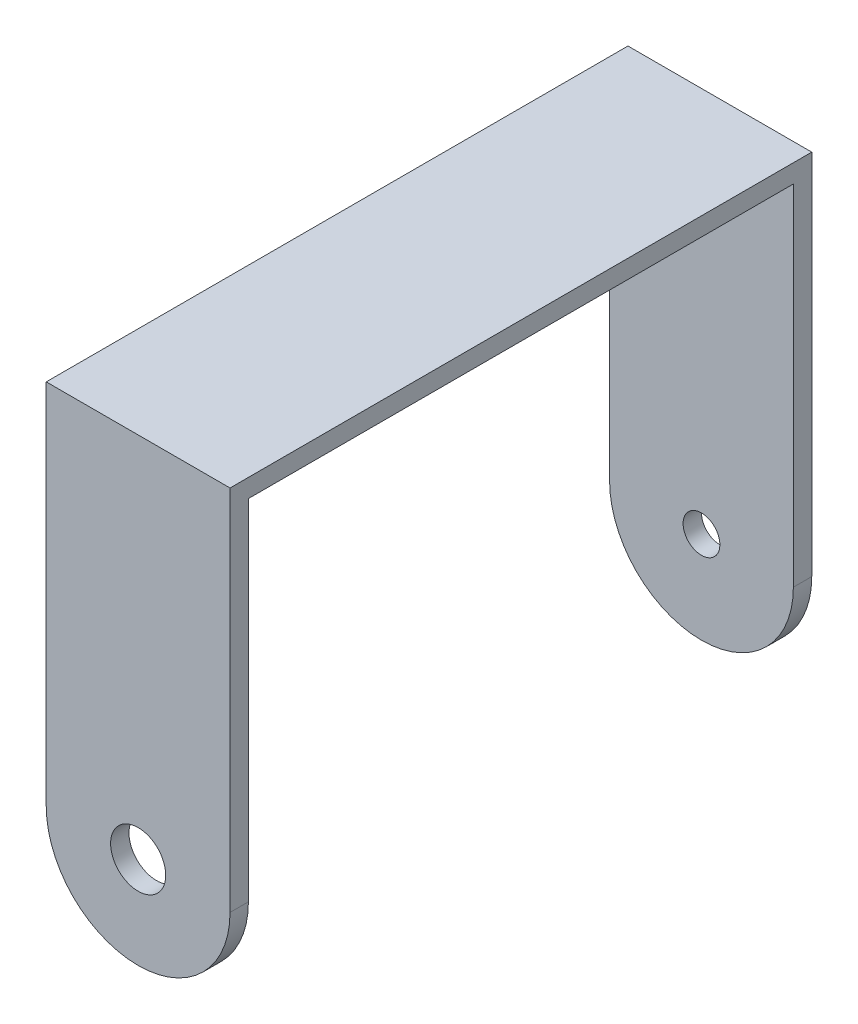
ISO-10303-21;
HEADER;
FILE_DESCRIPTION(('STEP AP214'),'2;1');
FILE_NAME('part.step','',(''),(''),'','','');
FILE_SCHEMA(('AUTOMOTIVE_DESIGN { 1 0 10303 214 1 1 1 1 }'));
ENDSEC;
DATA;
#1=APPLICATION_CONTEXT('core data for automotive mechanical design processes');
#2=APPLICATION_PROTOCOL_DEFINITION('international standard','automotive_design',2000,#1);
#3=PRODUCT_CONTEXT('',#1,'mechanical');
#4=PRODUCT('Part','Part','',(#3));
#5=PRODUCT_RELATED_PRODUCT_CATEGORY('part','',(#4));
#6=PRODUCT_DEFINITION_FORMATION('','',#4);
#7=PRODUCT_DEFINITION_CONTEXT('part definition',#1,'design');
#8=PRODUCT_DEFINITION('design','',#6,#7);
#9=PRODUCT_DEFINITION_SHAPE('','',#8);
#10=(LENGTH_UNIT() NAMED_UNIT(*) SI_UNIT(.MILLI.,.METRE.));
#11=(NAMED_UNIT(*) PLANE_ANGLE_UNIT() SI_UNIT($,.RADIAN.));
#12=(NAMED_UNIT(*) SI_UNIT($,.STERADIAN.) SOLID_ANGLE_UNIT());
#13=UNCERTAINTY_MEASURE_WITH_UNIT(LENGTH_MEASURE(1.E-05),#10,'distance_accuracy_value','');
#14=(GEOMETRIC_REPRESENTATION_CONTEXT(3) GLOBAL_UNCERTAINTY_ASSIGNED_CONTEXT((#13)) GLOBAL_UNIT_ASSIGNED_CONTEXT((#10,
#11,#12)) REPRESENTATION_CONTEXT('',''));
#15=CARTESIAN_POINT('',(0.,0.,0.));
#16=DIRECTION('',(0.,0.,1.));
#17=DIRECTION('',(1.,0.,0.));
#18=AXIS2_PLACEMENT_3D('',#15,#16,#17);
#19=CARTESIAN_POINT('',(0.,38.,63.3));
#20=DIRECTION('',(0.,1.,0.));
#21=DIRECTION('',(0.,0.,1.));
#22=AXIS2_PLACEMENT_3D('',#19,#20,#21);
#23=PLANE('',#22);
#24=DIRECTION('',(1.,0.,0.));
#25=VECTOR('',#24,1.);
#26=CARTESIAN_POINT('',(0.,38.,61.3));
#27=LINE('',#26,#25);
#28=CARTESIAN_POINT('',(0.,38.,61.3));
#29=VERTEX_POINT('',#28);
#30=CARTESIAN_POINT('',(20.,38.,61.3));
#31=VERTEX_POINT('',#30);
#32=EDGE_CURVE('E11',#29,#31,#27,.T.);
#33=ORIENTED_EDGE('',*,*,#32,.F.);
#34=DIRECTION('',(0.,0.,-1.));
#35=VECTOR('',#34,1.);
#36=CARTESIAN_POINT('',(0.,38.,63.3));
#37=LINE('',#36,#35);
#38=CARTESIAN_POINT('',(0.,38.,2.));
#39=VERTEX_POINT('',#38);
#40=EDGE_CURVE('E49',#29,#39,#37,.T.);
#41=ORIENTED_EDGE('',*,*,#40,.T.);
#42=DIRECTION('',(1.,0.,0.));
#43=VECTOR('',#42,1.);
#44=CARTESIAN_POINT('',(0.,38.,2.));
#45=LINE('',#44,#43);
#46=CARTESIAN_POINT('',(20.,38.,2.));
#47=VERTEX_POINT('',#46);
#48=EDGE_CURVE('E125',#39,#47,#45,.T.);
#49=ORIENTED_EDGE('',*,*,#48,.T.);
#50=DIRECTION('',(0.,0.,-1.));
#51=VECTOR('',#50,1.);
#52=CARTESIAN_POINT('',(20.,38.,63.3));
#53=LINE('',#52,#51);
#54=EDGE_CURVE('E102',#31,#47,#53,.T.);
#55=ORIENTED_EDGE('',*,*,#54,.F.);
#56=EDGE_LOOP('',(#33,#41,#49,#55));
#57=FACE_BOUND('',#56,.T.);
#58=ADVANCED_FACE('F34',(#57),#23,.F.);
#59=CARTESIAN_POINT('',(10.,0.,2.));
#60=DIRECTION('',(0.,0.,-1.));
#61=DIRECTION('',(-1.,0.,0.));
#62=AXIS2_PLACEMENT_3D('',#59,#60,#61);
#63=PLANE('',#62);
#64=CARTESIAN_POINT('',(10.,0.,2.));
#65=DIRECTION('',(0.,0.,1.));
#66=DIRECTION('',(1.,0.,0.));
#67=AXIS2_PLACEMENT_3D('',#64,#65,#66);
#68=CIRCLE('',#67,2.);
#69=CARTESIAN_POINT('',(12.,0.,2.));
#70=VERTEX_POINT('',#69);
#71=EDGE_CURVE('E159',#70,#70,#68,.T.);
#72=ORIENTED_EDGE('',*,*,#71,.F.);
#73=EDGE_LOOP('',(#72));
#74=FACE_BOUND('',#73,.T.);
#75=ORIENTED_EDGE('',*,*,#48,.F.);
#76=DIRECTION('',(0.,-1.,0.));
#77=VECTOR('',#76,1.);
#78=CARTESIAN_POINT('',(0.,0.,2.));
#79=LINE('',#78,#77);
#80=CARTESIAN_POINT('',(0.,0.,2.));
#81=VERTEX_POINT('',#80);
#82=EDGE_CURVE('E57',#39,#81,#79,.T.);
#83=ORIENTED_EDGE('',*,*,#82,.T.);
#84=CARTESIAN_POINT('',(10.,0.,2.));
#85=DIRECTION('',(0.,0.,1.));
#86=DIRECTION('',(-1.,0.,0.));
#87=AXIS2_PLACEMENT_3D('',#84,#85,#86);
#88=CIRCLE('',#87,10.);
#89=CARTESIAN_POINT('',(20.,0.,2.));
#90=VERTEX_POINT('',#89);
#91=EDGE_CURVE('E88',#81,#90,#88,.T.);
#92=ORIENTED_EDGE('',*,*,#91,.T.);
#93=DIRECTION('',(0.,1.,0.));
#94=VECTOR('',#93,1.);
#95=CARTESIAN_POINT('',(20.,0.,2.));
#96=LINE('',#95,#94);
#97=EDGE_CURVE('E116',#90,#47,#96,.T.);
#98=ORIENTED_EDGE('',*,*,#97,.T.);
#99=EDGE_LOOP('',(#75,#83,#92,#98));
#100=FACE_BOUND('',#99,.T.);
#101=ADVANCED_FACE('F120',(#74,#100),#63,.F.);
#102=CARTESIAN_POINT('',(10.,0.,2.));
#103=DIRECTION('',(0.,0.,-1.));
#104=DIRECTION('',(-1.,0.,0.));
#105=AXIS2_PLACEMENT_3D('',#102,#103,#104);
#106=CYLINDRICAL_SURFACE('',#105,10.);
#107=CARTESIAN_POINT('',(10.,0.,0.));
#108=DIRECTION('',(0.,0.,1.));
#109=DIRECTION('',(-1.,0.,0.));
#110=AXIS2_PLACEMENT_3D('',#107,#108,#109);
#111=CIRCLE('',#110,10.);
#112=CARTESIAN_POINT('',(0.,0.,0.));
#113=VERTEX_POINT('',#112);
#114=CARTESIAN_POINT('',(20.,0.,0.));
#115=VERTEX_POINT('',#114);
#116=EDGE_CURVE('E94',#113,#115,#111,.T.);
#117=ORIENTED_EDGE('',*,*,#116,.T.);
#118=DIRECTION('',(0.,0.,-1.));
#119=VECTOR('',#118,1.);
#120=CARTESIAN_POINT('',(20.,0.,2.));
#121=LINE('',#120,#119);
#122=EDGE_CURVE('E42',#90,#115,#121,.T.);
#123=ORIENTED_EDGE('',*,*,#122,.F.);
#124=ORIENTED_EDGE('',*,*,#91,.F.);
#125=DIRECTION('',(0.,0.,-1.));
#126=VECTOR('',#125,1.);
#127=CARTESIAN_POINT('',(0.,0.,2.));
#128=LINE('',#127,#126);
#129=EDGE_CURVE('E79',#81,#113,#128,.T.);
#130=ORIENTED_EDGE('',*,*,#129,.T.);
#131=EDGE_LOOP('',(#117,#123,#124,#130));
#132=FACE_BOUND('',#131,.T.);
#133=ADVANCED_FACE('F36',(#132),#106,.T.);
#134=CARTESIAN_POINT('',(20.,0.,2.));
#135=DIRECTION('',(-1.,0.,0.));
#136=DIRECTION('',(0.,0.,1.));
#137=AXIS2_PLACEMENT_3D('',#134,#135,#136);
#138=PLANE('',#137);
#139=DIRECTION('',(0.,1.,0.));
#140=VECTOR('',#139,1.);
#141=CARTESIAN_POINT('',(20.,40.,63.3));
#142=LINE('',#141,#140);
#143=CARTESIAN_POINT('',(20.,0.,63.3));
#144=VERTEX_POINT('',#143);
#145=CARTESIAN_POINT('',(20.,40.,63.3));
#146=VERTEX_POINT('',#145);
#147=EDGE_CURVE('E131',#144,#146,#142,.T.);
#148=ORIENTED_EDGE('',*,*,#147,.F.);
#149=DIRECTION('',(0.,0.,1.));
#150=VECTOR('',#149,1.);
#151=CARTESIAN_POINT('',(20.,0.,61.3));
#152=LINE('',#151,#150);
#153=CARTESIAN_POINT('',(20.,0.,61.3));
#154=VERTEX_POINT('',#153);
#155=EDGE_CURVE('E138',#154,#144,#152,.T.);
#156=ORIENTED_EDGE('',*,*,#155,.F.);
#157=DIRECTION('',(0.,1.,0.));
#158=VECTOR('',#157,1.);
#159=CARTESIAN_POINT('',(20.,0.,61.3));
#160=LINE('',#159,#158);
#161=EDGE_CURVE('E141',#154,#31,#160,.T.);
#162=ORIENTED_EDGE('',*,*,#161,.T.);
#163=ORIENTED_EDGE('',*,*,#54,.T.);
#164=ORIENTED_EDGE('',*,*,#97,.F.);
#165=ORIENTED_EDGE('',*,*,#122,.T.);
#166=DIRECTION('',(0.,1.,0.));
#167=VECTOR('',#166,1.);
#168=CARTESIAN_POINT('',(20.,0.,0.));
#169=LINE('',#168,#167);
#170=CARTESIAN_POINT('',(20.,40.,0.));
#171=VERTEX_POINT('',#170);
#172=EDGE_CURVE('E98',#115,#171,#169,.T.);
#173=ORIENTED_EDGE('',*,*,#172,.T.);
#174=DIRECTION('',(0.,0.,-1.));
#175=VECTOR('',#174,1.);
#176=CARTESIAN_POINT('',(20.,40.,2.));
#177=LINE('',#176,#175);
#178=EDGE_CURVE('E109',#146,#171,#177,.T.);
#179=ORIENTED_EDGE('',*,*,#178,.F.);
#180=EDGE_LOOP('',(#148,#156,#162,#163,#164,#165,#173,#179));
#181=FACE_BOUND('',#180,.T.);
#182=ADVANCED_FACE('F112',(#181),#138,.F.);
#183=CARTESIAN_POINT('',(0.,40.,2.));
#184=DIRECTION('',(0.,-1.,0.));
#185=DIRECTION('',(0.,0.,-1.));
#186=AXIS2_PLACEMENT_3D('',#183,#184,#185);
#187=PLANE('',#186);
#188=ORIENTED_EDGE('',*,*,#178,.T.);
#189=DIRECTION('',(-1.,0.,0.));
#190=VECTOR('',#189,1.);
#191=CARTESIAN_POINT('',(0.,40.,0.));
#192=LINE('',#191,#190);
#193=CARTESIAN_POINT('',(0.,40.,0.));
#194=VERTEX_POINT('',#193);
#195=EDGE_CURVE('E89',#171,#194,#192,.T.);
#196=ORIENTED_EDGE('',*,*,#195,.T.);
#197=DIRECTION('',(0.,0.,-1.));
#198=VECTOR('',#197,1.);
#199=CARTESIAN_POINT('',(0.,40.,2.));
#200=LINE('',#199,#198);
#201=CARTESIAN_POINT('',(0.,40.,63.3));
#202=VERTEX_POINT('',#201);
#203=EDGE_CURVE('E83',#202,#194,#200,.T.);
#204=ORIENTED_EDGE('',*,*,#203,.F.);
#205=DIRECTION('',(-1.,0.,0.));
#206=VECTOR('',#205,1.);
#207=CARTESIAN_POINT('',(0.,40.,63.3));
#208=LINE('',#207,#206);
#209=EDGE_CURVE('E124',#146,#202,#208,.T.);
#210=ORIENTED_EDGE('',*,*,#209,.F.);
#211=EDGE_LOOP('',(#188,#196,#204,#210));
#212=FACE_BOUND('',#211,.T.);
#213=ADVANCED_FACE('F187',(#212),#187,.F.);
#214=CARTESIAN_POINT('',(0.,0.,2.));
#215=DIRECTION('',(1.,0.,0.));
#216=DIRECTION('',(0.,0.,-1.));
#217=AXIS2_PLACEMENT_3D('',#214,#215,#216);
#218=PLANE('',#217);
#219=ORIENTED_EDGE('',*,*,#203,.T.);
#220=DIRECTION('',(0.,-1.,0.));
#221=VECTOR('',#220,1.);
#222=CARTESIAN_POINT('',(0.,0.,0.));
#223=LINE('',#222,#221);
#224=EDGE_CURVE('E76',#194,#113,#223,.T.);
#225=ORIENTED_EDGE('',*,*,#224,.T.);
#226=ORIENTED_EDGE('',*,*,#129,.F.);
#227=ORIENTED_EDGE('',*,*,#82,.F.);
#228=ORIENTED_EDGE('',*,*,#40,.F.);
#229=DIRECTION('',(0.,-1.,0.));
#230=VECTOR('',#229,1.);
#231=CARTESIAN_POINT('',(0.,0.,61.3));
#232=LINE('',#231,#230);
#233=CARTESIAN_POINT('',(0.,0.,61.3));
#234=VERTEX_POINT('',#233);
#235=EDGE_CURVE('E148',#29,#234,#232,.T.);
#236=ORIENTED_EDGE('',*,*,#235,.T.);
#237=DIRECTION('',(0.,0.,1.));
#238=VECTOR('',#237,1.);
#239=CARTESIAN_POINT('',(0.,0.,61.3));
#240=LINE('',#239,#238);
#241=CARTESIAN_POINT('',(0.,0.,63.3));
#242=VERTEX_POINT('',#241);
#243=EDGE_CURVE('E128',#234,#242,#240,.T.);
#244=ORIENTED_EDGE('',*,*,#243,.T.);
#245=DIRECTION('',(0.,-1.,0.));
#246=VECTOR('',#245,1.);
#247=CARTESIAN_POINT('',(0.,40.,63.3));
#248=LINE('',#247,#246);
#249=EDGE_CURVE('E127',#202,#242,#248,.T.);
#250=ORIENTED_EDGE('',*,*,#249,.F.);
#251=EDGE_LOOP('',(#219,#225,#226,#227,#228,#236,#244,#250));
#252=FACE_BOUND('',#251,.T.);
#253=ADVANCED_FACE('F78',(#252),#218,.F.);
#254=CARTESIAN_POINT('',(10.,0.,0.));
#255=DIRECTION('',(0.,0.,-1.));
#256=DIRECTION('',(-1.,0.,0.));
#257=AXIS2_PLACEMENT_3D('',#254,#255,#256);
#258=PLANE('',#257);
#259=CARTESIAN_POINT('',(10.,0.,0.));
#260=DIRECTION('',(0.,0.,1.));
#261=DIRECTION('',(1.,0.,0.));
#262=AXIS2_PLACEMENT_3D('',#259,#260,#261);
#263=CIRCLE('',#262,2.);
#264=CARTESIAN_POINT('',(12.,0.,0.));
#265=VERTEX_POINT('',#264);
#266=EDGE_CURVE('E158',#265,#265,#263,.T.);
#267=ORIENTED_EDGE('',*,*,#266,.T.);
#268=EDGE_LOOP('',(#267));
#269=FACE_BOUND('',#268,.T.);
#270=ORIENTED_EDGE('',*,*,#116,.F.);
#271=ORIENTED_EDGE('',*,*,#224,.F.);
#272=ORIENTED_EDGE('',*,*,#195,.F.);
#273=ORIENTED_EDGE('',*,*,#172,.F.);
#274=EDGE_LOOP('',(#270,#271,#272,#273));
#275=FACE_BOUND('',#274,.T.);
#276=ADVANCED_FACE('F96',(#269,#275),#258,.T.);
#277=CARTESIAN_POINT('',(0.,0.,63.3));
#278=DIRECTION('',(0.,0.,1.));
#279=DIRECTION('',(1.,0.,0.));
#280=AXIS2_PLACEMENT_3D('',#277,#278,#279);
#281=PLANE('',#280);
#282=CARTESIAN_POINT('',(10.,0.,63.3));
#283=DIRECTION('',(0.,0.,1.));
#284=DIRECTION('',(1.,0.,0.));
#285=AXIS2_PLACEMENT_3D('',#282,#283,#284);
#286=CIRCLE('',#285,3.);
#287=CARTESIAN_POINT('',(13.,0.,63.3));
#288=VERTEX_POINT('',#287);
#289=EDGE_CURVE('E155',#288,#288,#286,.T.);
#290=ORIENTED_EDGE('',*,*,#289,.F.);
#291=EDGE_LOOP('',(#290));
#292=FACE_BOUND('',#291,.T.);
#293=ORIENTED_EDGE('',*,*,#249,.T.);
#294=CARTESIAN_POINT('',(10.,0.,63.3));
#295=DIRECTION('',(0.,0.,1.));
#296=DIRECTION('',(-1.,0.,0.));
#297=AXIS2_PLACEMENT_3D('',#294,#295,#296);
#298=CIRCLE('',#297,10.);
#299=EDGE_CURVE('E142',#242,#144,#298,.T.);
#300=ORIENTED_EDGE('',*,*,#299,.T.);
#301=ORIENTED_EDGE('',*,*,#147,.T.);
#302=ORIENTED_EDGE('',*,*,#209,.T.);
#303=EDGE_LOOP('',(#293,#300,#301,#302));
#304=FACE_BOUND('',#303,.T.);
#305=ADVANCED_FACE('F184',(#292,#304),#281,.T.);
#306=CARTESIAN_POINT('',(10.,0.,61.3));
#307=DIRECTION('',(0.,0.,1.));
#308=DIRECTION('',(-1.,0.,0.));
#309=AXIS2_PLACEMENT_3D('',#306,#307,#308);
#310=PLANE('',#309);
#311=CARTESIAN_POINT('',(10.,0.,61.3));
#312=DIRECTION('',(0.,0.,1.));
#313=DIRECTION('',(1.,0.,0.));
#314=AXIS2_PLACEMENT_3D('',#311,#312,#313);
#315=CIRCLE('',#314,3.);
#316=CARTESIAN_POINT('',(13.,0.,61.3));
#317=VERTEX_POINT('',#316);
#318=EDGE_CURVE('E146',#317,#317,#315,.F.);
#319=ORIENTED_EDGE('',*,*,#318,.F.);
#320=EDGE_LOOP('',(#319));
#321=FACE_BOUND('',#320,.T.);
#322=ORIENTED_EDGE('',*,*,#235,.F.);
#323=ORIENTED_EDGE('',*,*,#32,.T.);
#324=ORIENTED_EDGE('',*,*,#161,.F.);
#325=CARTESIAN_POINT('',(10.,0.,61.3));
#326=DIRECTION('',(0.,0.,1.));
#327=DIRECTION('',(-1.,0.,0.));
#328=AXIS2_PLACEMENT_3D('',#325,#326,#327);
#329=CIRCLE('',#328,10.);
#330=EDGE_CURVE('E145',#234,#154,#329,.T.);
#331=ORIENTED_EDGE('',*,*,#330,.F.);
#332=EDGE_LOOP('',(#322,#323,#324,#331));
#333=FACE_BOUND('',#332,.T.);
#334=ADVANCED_FACE('F216',(#321,#333),#310,.F.);
#335=CARTESIAN_POINT('',(10.,0.,61.3));
#336=DIRECTION('',(0.,0.,1.));
#337=DIRECTION('',(1.,0.,0.));
#338=AXIS2_PLACEMENT_3D('',#335,#336,#337);
#339=CYLINDRICAL_SURFACE('',#338,10.);
#340=ORIENTED_EDGE('',*,*,#299,.F.);
#341=ORIENTED_EDGE('',*,*,#243,.F.);
#342=ORIENTED_EDGE('',*,*,#330,.T.);
#343=ORIENTED_EDGE('',*,*,#155,.T.);
#344=EDGE_LOOP('',(#340,#341,#342,#343));
#345=FACE_BOUND('',#344,.T.);
#346=ADVANCED_FACE('F223',(#345),#339,.T.);
#347=CARTESIAN_POINT('',(10.,0.,-0.001000000000001));
#348=DIRECTION('',(0.,0.,1.));
#349=DIRECTION('',(1.,0.,0.));
#350=AXIS2_PLACEMENT_3D('',#347,#348,#349);
#351=CYLINDRICAL_SURFACE('',#350,3.);
#352=ORIENTED_EDGE('',*,*,#289,.T.);
#353=EDGE_LOOP('',(#352));
#354=FACE_BOUND('',#353,.T.);
#355=ORIENTED_EDGE('',*,*,#318,.T.);
#356=EDGE_LOOP('',(#355));
#357=FACE_BOUND('',#356,.T.);
#358=ADVANCED_FACE('F169',(#354,#357),#351,.F.);
#359=CARTESIAN_POINT('',(10.,0.,0.));
#360=DIRECTION('',(0.,0.,1.));
#361=DIRECTION('',(1.,0.,0.));
#362=AXIS2_PLACEMENT_3D('',#359,#360,#361);
#363=CYLINDRICAL_SURFACE('',#362,2.);
#364=ORIENTED_EDGE('',*,*,#266,.F.);
#365=EDGE_LOOP('',(#364));
#366=FACE_BOUND('',#365,.T.);
#367=ORIENTED_EDGE('',*,*,#71,.T.);
#368=EDGE_LOOP('',(#367));
#369=FACE_BOUND('',#368,.T.);
#370=ADVANCED_FACE('F166',(#366,#369),#363,.F.);
#371=CLOSED_SHELL('',(#58,#101,#133,#182,#213,#253,#276,#305,#334,#346,#358,#370));
#372=MANIFOLD_SOLID_BREP('B2',#371);
#373=ADVANCED_BREP_SHAPE_REPRESENTATION('',(#18,#372),#14);
#374=SHAPE_DEFINITION_REPRESENTATION(#9,#373);
ENDSEC;
END-ISO-10303-21;
